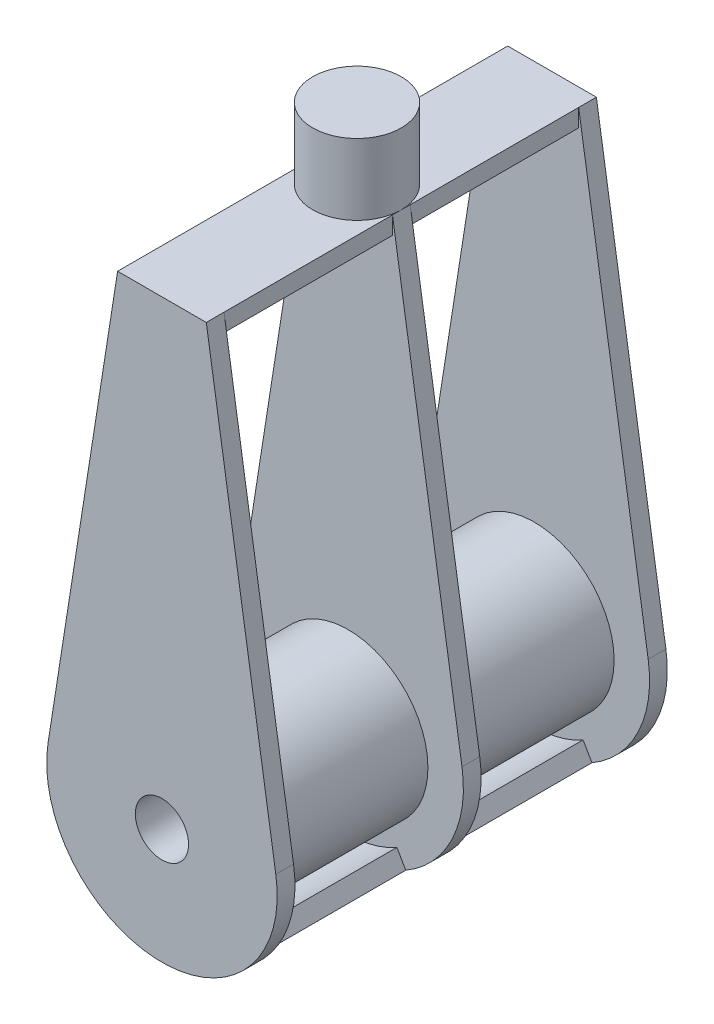
ISO-10303-21;
HEADER;
FILE_DESCRIPTION(('STEP AP214'),'2;1');
FILE_NAME('part.step','',(''),(''),'','','');
FILE_SCHEMA(('AUTOMOTIVE_DESIGN { 1 0 10303 214 1 1 1 1 }'));
ENDSEC;
DATA;
#1=APPLICATION_CONTEXT('core data for automotive mechanical design processes');
#2=APPLICATION_PROTOCOL_DEFINITION('international standard','automotive_design',2000,#1);
#3=PRODUCT_CONTEXT('',#1,'mechanical');
#4=PRODUCT('Part','Part','',(#3));
#5=PRODUCT_RELATED_PRODUCT_CATEGORY('part','',(#4));
#6=PRODUCT_DEFINITION_FORMATION('','',#4);
#7=PRODUCT_DEFINITION_CONTEXT('part definition',#1,'design');
#8=PRODUCT_DEFINITION('design','',#6,#7);
#9=PRODUCT_DEFINITION_SHAPE('','',#8);
#10=(LENGTH_UNIT() NAMED_UNIT(*) SI_UNIT(.MILLI.,.METRE.));
#11=(NAMED_UNIT(*) PLANE_ANGLE_UNIT() SI_UNIT($,.RADIAN.));
#12=(NAMED_UNIT(*) SI_UNIT($,.STERADIAN.) SOLID_ANGLE_UNIT());
#13=UNCERTAINTY_MEASURE_WITH_UNIT(LENGTH_MEASURE(1.E-05),#10,'distance_accuracy_value','');
#14=(GEOMETRIC_REPRESENTATION_CONTEXT(3) GLOBAL_UNCERTAINTY_ASSIGNED_CONTEXT((#13)) GLOBAL_UNIT_ASSIGNED_CONTEXT((#10,
#11,#12)) REPRESENTATION_CONTEXT('',''));
#15=CARTESIAN_POINT('',(0.,0.,0.));
#16=DIRECTION('',(0.,0.,1.));
#17=DIRECTION('',(1.,0.,0.));
#18=AXIS2_PLACEMENT_3D('',#15,#16,#17);
#19=CARTESIAN_POINT('',(-2.5,26.,1.));
#20=DIRECTION('',(0.,-1.,0.));
#21=DIRECTION('',(0.,0.,-1.));
#22=AXIS2_PLACEMENT_3D('',#19,#20,#21);
#23=PLANE('',#22);
#24=CARTESIAN_POINT('',(0.,26.,11.));
#25=DIRECTION('',(0.,1.,0.));
#26=DIRECTION('',(0.,0.,1.));
#27=AXIS2_PLACEMENT_3D('',#24,#25,#26);
#28=CIRCLE('',#27,2.49999999999773);
#29=CARTESIAN_POINT('',(-2.50000000004036,26.,11.));
#30=VERTEX_POINT('',#29);
#31=CARTESIAN_POINT('',(2.49999999999773,26.0000000000105,11.));
#32=VERTEX_POINT('',#31);
#33=EDGE_CURVE('E254',#30,#32,#28,.T.);
#34=ORIENTED_EDGE('',*,*,#33,.F.);
#35=DIRECTION('',(0.,0.,-1.));
#36=VECTOR('',#35,1.);
#37=CARTESIAN_POINT('',(-2.50000000005457,26.0000000000105,11.5));
#38=LINE('',#37,#36);
#39=CARTESIAN_POINT('',(-2.5,26.,11.5));
#40=VERTEX_POINT('',#39);
#41=EDGE_CURVE('E287',#40,#30,#38,.T.);
#42=ORIENTED_EDGE('',*,*,#41,.F.);
#43=DIRECTION('',(0.,0.,1.));
#44=VECTOR('',#43,1.);
#45=CARTESIAN_POINT('',(-2.5,26.,0.));
#46=LINE('',#45,#44);
#47=CARTESIAN_POINT('',(-2.5,26.,21.));
#48=VERTEX_POINT('',#47);
#49=EDGE_CURVE('E338',#40,#48,#46,.T.);
#50=ORIENTED_EDGE('',*,*,#49,.T.);
#51=DIRECTION('',(0.,0.,1.));
#52=VECTOR('',#51,1.);
#53=CARTESIAN_POINT('',(-2.5,26.,21.));
#54=LINE('',#53,#52);
#55=CARTESIAN_POINT('',(-2.5,26.,22.));
#56=VERTEX_POINT('',#55);
#57=EDGE_CURVE('E321',#48,#56,#54,.T.);
#58=ORIENTED_EDGE('',*,*,#57,.T.);
#59=DIRECTION('',(1.,0.,0.));
#60=VECTOR('',#59,1.);
#61=CARTESIAN_POINT('',(-2.5,26.,22.));
#62=LINE('',#61,#60);
#63=CARTESIAN_POINT('',(2.5,26.,22.));
#64=VERTEX_POINT('',#63);
#65=EDGE_CURVE('E355',#56,#64,#62,.T.);
#66=ORIENTED_EDGE('',*,*,#65,.T.);
#67=DIRECTION('',(0.,0.,-1.));
#68=VECTOR('',#67,1.);
#69=CARTESIAN_POINT('',(2.5,26.,0.));
#70=LINE('',#69,#68);
#71=CARTESIAN_POINT('',(2.5,26.,21.));
#72=VERTEX_POINT('',#71);
#73=EDGE_CURVE('E359',#64,#72,#70,.T.);
#74=ORIENTED_EDGE('',*,*,#73,.T.);
#75=CARTESIAN_POINT('',(2.49999999999773,26.0000000000105,11.5));
#76=VERTEX_POINT('',#75);
#77=EDGE_CURVE('E358',#72,#76,#70,.T.);
#78=ORIENTED_EDGE('',*,*,#77,.T.);
#79=DIRECTION('',(0.,0.,-1.));
#80=VECTOR('',#79,1.);
#81=CARTESIAN_POINT('',(2.49999999999773,26.0000000000105,11.5));
#82=LINE('',#81,#80);
#83=EDGE_CURVE('E282',#76,#32,#82,.T.);
#84=ORIENTED_EDGE('',*,*,#83,.T.);
#85=EDGE_LOOP('',(#34,#42,#50,#58,#66,#74,#78,#84));
#86=FACE_BOUND('',#85,.T.);
#87=ADVANCED_FACE('F41',(#86),#23,.F.);
#88=CARTESIAN_POINT('',(-2.5,25.,0.));
#89=DIRECTION('',(-1.,0.,0.));
#90=DIRECTION('',(0.,0.,1.));
#91=AXIS2_PLACEMENT_3D('',#88,#89,#90);
#92=PLANE('',#91);
#93=DIRECTION('',(0.,0.,1.));
#94=VECTOR('',#93,1.);
#95=CARTESIAN_POINT('',(-2.5,25.,0.));
#96=LINE('',#95,#94);
#97=CARTESIAN_POINT('',(-2.5,25.,1.));
#98=VERTEX_POINT('',#97);
#99=CARTESIAN_POINT('',(-2.5,25.,10.5));
#100=VERTEX_POINT('',#99);
#101=EDGE_CURVE('E342',#98,#100,#96,.T.);
#102=ORIENTED_EDGE('',*,*,#101,.T.);
#103=DIRECTION('',(0.,1.,0.));
#104=VECTOR('',#103,1.);
#105=CARTESIAN_POINT('',(-2.5,25.,10.5));
#106=LINE('',#105,#104);
#107=CARTESIAN_POINT('',(-2.50000000005457,26.0000000000105,10.5));
#108=VERTEX_POINT('',#107);
#109=EDGE_CURVE('E299',#100,#108,#106,.T.);
#110=ORIENTED_EDGE('',*,*,#109,.T.);
#111=CARTESIAN_POINT('',(-2.5,26.,1.));
#112=VERTEX_POINT('',#111);
#113=EDGE_CURVE('E348',#112,#108,#46,.T.);
#114=ORIENTED_EDGE('',*,*,#113,.F.);
#115=DIRECTION('',(0.,-1.,0.));
#116=VECTOR('',#115,1.);
#117=CARTESIAN_POINT('',(-2.5,0.,1.));
#118=LINE('',#117,#116);
#119=EDGE_CURVE('E349',#112,#98,#118,.T.);
#120=ORIENTED_EDGE('',*,*,#119,.T.);
#121=EDGE_LOOP('',(#102,#110,#114,#120));
#122=FACE_BOUND('',#121,.T.);
#123=ADVANCED_FACE('F514',(#122),#92,.T.);
#124=CARTESIAN_POINT('',(2.5,25.,0.));
#125=DIRECTION('',(1.,0.,0.));
#126=DIRECTION('',(0.,0.,-1.));
#127=AXIS2_PLACEMENT_3D('',#124,#125,#126);
#128=PLANE('',#127);
#129=CARTESIAN_POINT('',(2.49999999999773,26.0000000000105,10.5));
#130=VERTEX_POINT('',#129);
#131=CARTESIAN_POINT('',(2.5,26.,1.));
#132=VERTEX_POINT('',#131);
#133=EDGE_CURVE('E357',#130,#132,#70,.T.);
#134=ORIENTED_EDGE('',*,*,#133,.F.);
#135=DIRECTION('',(0.,-1.,0.));
#136=VECTOR('',#135,1.);
#137=CARTESIAN_POINT('',(2.5,25.,10.5));
#138=LINE('',#137,#136);
#139=CARTESIAN_POINT('',(2.5,25.,10.5));
#140=VERTEX_POINT('',#139);
#141=EDGE_CURVE('E294',#130,#140,#138,.T.);
#142=ORIENTED_EDGE('',*,*,#141,.T.);
#143=DIRECTION('',(0.,0.,-1.));
#144=VECTOR('',#143,1.);
#145=CARTESIAN_POINT('',(2.5,25.,0.));
#146=LINE('',#145,#144);
#147=CARTESIAN_POINT('',(2.5,25.,1.));
#148=VERTEX_POINT('',#147);
#149=EDGE_CURVE('E341',#140,#148,#146,.T.);
#150=ORIENTED_EDGE('',*,*,#149,.T.);
#151=DIRECTION('',(0.,1.,0.));
#152=VECTOR('',#151,1.);
#153=CARTESIAN_POINT('',(2.5,0.,1.));
#154=LINE('',#153,#152);
#155=EDGE_CURVE('E361',#148,#132,#154,.T.);
#156=ORIENTED_EDGE('',*,*,#155,.T.);
#157=EDGE_LOOP('',(#134,#142,#150,#156));
#158=FACE_BOUND('',#157,.T.);
#159=ADVANCED_FACE('F503',(#158),#128,.T.);
#160=CARTESIAN_POINT('',(0.,25.,0.));
#161=DIRECTION('',(0.,1.,0.));
#162=DIRECTION('',(0.,0.,1.));
#163=AXIS2_PLACEMENT_3D('',#160,#161,#162);
#164=PLANE('',#163);
#165=DIRECTION('',(1.,0.,0.));
#166=VECTOR('',#165,1.);
#167=CARTESIAN_POINT('',(0.,25.,10.5));
#168=LINE('',#167,#166);
#169=EDGE_CURVE('E281',#100,#140,#168,.T.);
#170=ORIENTED_EDGE('',*,*,#169,.F.);
#171=ORIENTED_EDGE('',*,*,#101,.F.);
#172=DIRECTION('',(-1.,0.,0.));
#173=VECTOR('',#172,1.);
#174=CARTESIAN_POINT('',(0.,25.,1.));
#175=LINE('',#174,#173);
#176=EDGE_CURVE('E368',#148,#98,#175,.T.);
#177=ORIENTED_EDGE('',*,*,#176,.F.);
#178=ORIENTED_EDGE('',*,*,#149,.F.);
#179=EDGE_LOOP('',(#170,#171,#177,#178));
#180=FACE_BOUND('',#179,.T.);
#181=ADVANCED_FACE('F515',(#180),#164,.F.);
#182=DIRECTION('',(0.,1.,0.));
#183=VECTOR('',#182,1.);
#184=CARTESIAN_POINT('',(-2.5,25.,11.5));
#185=LINE('',#184,#183);
#186=CARTESIAN_POINT('',(-2.5,25.,11.5));
#187=VERTEX_POINT('',#186);
#188=EDGE_CURVE('E303',#187,#40,#185,.T.);
#189=ORIENTED_EDGE('',*,*,#188,.F.);
#190=CARTESIAN_POINT('',(-2.5,25.,21.));
#191=VERTEX_POINT('',#190);
#192=EDGE_CURVE('E343',#187,#191,#96,.T.);
#193=ORIENTED_EDGE('',*,*,#192,.T.);
#194=DIRECTION('',(0.,1.,0.));
#195=VECTOR('',#194,1.);
#196=CARTESIAN_POINT('',(-2.5,25.,21.));
#197=LINE('',#196,#195);
#198=EDGE_CURVE('E339',#191,#48,#197,.T.);
#199=ORIENTED_EDGE('',*,*,#198,.T.);
#200=ORIENTED_EDGE('',*,*,#49,.F.);
#201=EDGE_LOOP('',(#189,#193,#199,#200));
#202=FACE_BOUND('',#201,.T.);
#203=ADVANCED_FACE('F444',(#202),#92,.T.);
#204=DIRECTION('',(0.,-1.,0.));
#205=VECTOR('',#204,1.);
#206=CARTESIAN_POINT('',(2.5,25.,11.5));
#207=LINE('',#206,#205);
#208=CARTESIAN_POINT('',(2.5,25.,11.5));
#209=VERTEX_POINT('',#208);
#210=EDGE_CURVE('E305',#76,#209,#207,.T.);
#211=ORIENTED_EDGE('',*,*,#210,.F.);
#212=ORIENTED_EDGE('',*,*,#77,.F.);
#213=DIRECTION('',(0.,-1.,0.));
#214=VECTOR('',#213,1.);
#215=CARTESIAN_POINT('',(2.5,25.,21.));
#216=LINE('',#215,#214);
#217=CARTESIAN_POINT('',(2.5,25.,21.));
#218=VERTEX_POINT('',#217);
#219=EDGE_CURVE('E331',#72,#218,#216,.T.);
#220=ORIENTED_EDGE('',*,*,#219,.T.);
#221=EDGE_CURVE('E347',#218,#209,#146,.T.);
#222=ORIENTED_EDGE('',*,*,#221,.T.);
#223=EDGE_LOOP('',(#211,#212,#220,#222));
#224=FACE_BOUND('',#223,.T.);
#225=ADVANCED_FACE('F455',(#224),#128,.T.);
#226=ORIENTED_EDGE('',*,*,#192,.F.);
#227=DIRECTION('',(1.,0.,0.));
#228=VECTOR('',#227,1.);
#229=CARTESIAN_POINT('',(0.,25.,11.5));
#230=LINE('',#229,#228);
#231=EDGE_CURVE('E298',#187,#209,#230,.T.);
#232=ORIENTED_EDGE('',*,*,#231,.T.);
#233=ORIENTED_EDGE('',*,*,#221,.F.);
#234=DIRECTION('',(1.,0.,0.));
#235=VECTOR('',#234,1.);
#236=CARTESIAN_POINT('',(0.,25.,21.));
#237=LINE('',#236,#235);
#238=EDGE_CURVE('E396',#191,#218,#237,.T.);
#239=ORIENTED_EDGE('',*,*,#238,.F.);
#240=EDGE_LOOP('',(#226,#232,#233,#239));
#241=FACE_BOUND('',#240,.T.);
#242=ADVANCED_FACE('F449',(#241),#164,.F.);
#243=CARTESIAN_POINT('',(0.,0.,1.));
#244=DIRECTION('',(0.,0.,1.));
#245=DIRECTION('',(1.,0.,0.));
#246=AXIS2_PLACEMENT_3D('',#243,#244,#245);
#247=PLANE('',#246);
#248=CARTESIAN_POINT('',(0.,0.,1.));
#249=DIRECTION('',(0.,0.,1.));
#250=DIRECTION('',(1.,0.,0.));
#251=AXIS2_PLACEMENT_3D('',#248,#249,#250);
#252=CIRCLE('',#251,4.5);
#253=CARTESIAN_POINT('',(4.5,0.,1.));
#254=VERTEX_POINT('',#253);
#255=EDGE_CURVE('E11',#254,#254,#252,.T.);
#256=ORIENTED_EDGE('',*,*,#255,.F.);
#257=EDGE_LOOP('',(#256));
#258=FACE_BOUND('',#257,.T.);
#259=DIRECTION('',(-0.500000000000001,-0.866025403784438,0.));
#260=VECTOR('',#259,1.);
#261=CARTESIAN_POINT('',(0.,0.,1.));
#262=LINE('',#261,#260);
#263=CARTESIAN_POINT('',(-2.75,-4.76313972081441,1.));
#264=VERTEX_POINT('',#263);
#265=CARTESIAN_POINT('',(-3.25,-5.62916512459885,1.));
#266=VERTEX_POINT('',#265);
#267=EDGE_CURVE('E59',#264,#266,#262,.T.);
#268=ORIENTED_EDGE('',*,*,#267,.F.);
#269=CARTESIAN_POINT('',(0.,0.,1.));
#270=DIRECTION('',(0.,0.,1.));
#271=DIRECTION('',(1.,0.,0.));
#272=AXIS2_PLACEMENT_3D('',#269,#270,#271);
#273=CIRCLE('',#272,5.5);
#274=CARTESIAN_POINT('',(2.75000000000001,-4.76313972081441,1.));
#275=VERTEX_POINT('',#274);
#276=EDGE_CURVE('E64',#275,#264,#273,.F.);
#277=ORIENTED_EDGE('',*,*,#276,.F.);
#278=DIRECTION('',(-0.500000000000001,0.866025403784438,0.));
#279=VECTOR('',#278,1.);
#280=CARTESIAN_POINT('',(0.,0.,1.));
#281=LINE('',#280,#279);
#282=CARTESIAN_POINT('',(3.25000000000001,-5.62916512459885,1.00000000000001));
#283=VERTEX_POINT('',#282);
#284=EDGE_CURVE('E240',#283,#275,#281,.T.);
#285=ORIENTED_EDGE('',*,*,#284,.F.);
#286=CARTESIAN_POINT('',(0.,0.,1.));
#287=DIRECTION('',(0.,0.,1.));
#288=DIRECTION('',(1.,0.,0.));
#289=AXIS2_PLACEMENT_3D('',#286,#287,#288);
#290=CIRCLE('',#289,6.5);
#291=CARTESIAN_POINT('',(6.42143553909513,1.00755427508701,1.));
#292=VERTEX_POINT('',#291);
#293=EDGE_CURVE('E374',#283,#292,#290,.T.);
#294=ORIENTED_EDGE('',*,*,#293,.T.);
#295=DIRECTION('',(-0.155008350013386,0.987913159860788,0.));
#296=VECTOR('',#295,1.);
#297=CARTESIAN_POINT('',(2.5,26.,1.));
#298=LINE('',#297,#296);
#299=EDGE_CURVE('E372',#292,#132,#298,.T.);
#300=ORIENTED_EDGE('',*,*,#299,.T.);
#301=ORIENTED_EDGE('',*,*,#155,.F.);
#302=ORIENTED_EDGE('',*,*,#176,.T.);
#303=ORIENTED_EDGE('',*,*,#119,.F.);
#304=DIRECTION('',(-0.155008350013386,-0.987913159860788,0.));
#305=VECTOR('',#304,1.);
#306=CARTESIAN_POINT('',(-2.5,26.,1.));
#307=LINE('',#306,#305);
#308=CARTESIAN_POINT('',(-6.42143553909513,1.00755427508701,1.));
#309=VERTEX_POINT('',#308);
#310=EDGE_CURVE('E378',#112,#309,#307,.T.);
#311=ORIENTED_EDGE('',*,*,#310,.T.);
#312=EDGE_CURVE('E375',#309,#266,#290,.T.);
#313=ORIENTED_EDGE('',*,*,#312,.T.);
#314=EDGE_LOOP('',(#268,#277,#285,#294,#300,#301,#302,#303,#311,#313));
#315=FACE_BOUND('',#314,.T.);
#316=ADVANCED_FACE('F485',(#258,#315),#247,.T.);
#317=CARTESIAN_POINT('',(0.,0.,0.));
#318=DIRECTION('',(0.,0.,1.));
#319=DIRECTION('',(1.,0.,0.));
#320=AXIS2_PLACEMENT_3D('',#317,#318,#319);
#321=PLANE('',#320);
#322=DIRECTION('',(-0.155008350013386,0.987913159860788,0.));
#323=VECTOR('',#322,1.);
#324=CARTESIAN_POINT('',(2.5,26.,0.));
#325=LINE('',#324,#323);
#326=CARTESIAN_POINT('',(6.42143553909513,1.00755427508701,0.));
#327=VERTEX_POINT('',#326);
#328=CARTESIAN_POINT('',(2.5,26.,0.));
#329=VERTEX_POINT('',#328);
#330=EDGE_CURVE('E385',#327,#329,#325,.T.);
#331=ORIENTED_EDGE('',*,*,#330,.F.);
#332=CARTESIAN_POINT('',(0.,0.,0.));
#333=DIRECTION('',(0.,0.,1.));
#334=DIRECTION('',(1.,0.,0.));
#335=AXIS2_PLACEMENT_3D('',#332,#333,#334);
#336=CIRCLE('',#335,6.5);
#337=CARTESIAN_POINT('',(-6.42143553909513,1.00755427508701,0.));
#338=VERTEX_POINT('',#337);
#339=EDGE_CURVE('E371',#338,#327,#336,.T.);
#340=ORIENTED_EDGE('',*,*,#339,.F.);
#341=DIRECTION('',(-0.155008350013386,-0.987913159860788,0.));
#342=VECTOR('',#341,1.);
#343=CARTESIAN_POINT('',(-2.5,26.,0.));
#344=LINE('',#343,#342);
#345=CARTESIAN_POINT('',(-2.5,26.,0.));
#346=VERTEX_POINT('',#345);
#347=EDGE_CURVE('E387',#346,#338,#344,.T.);
#348=ORIENTED_EDGE('',*,*,#347,.F.);
#349=DIRECTION('',(-1.,0.,0.));
#350=VECTOR('',#349,1.);
#351=CARTESIAN_POINT('',(-2.5,26.,0.));
#352=LINE('',#351,#350);
#353=EDGE_CURVE('E383',#329,#346,#352,.T.);
#354=ORIENTED_EDGE('',*,*,#353,.F.);
#355=EDGE_LOOP('',(#331,#340,#348,#354));
#356=FACE_BOUND('',#355,.T.);
#357=CARTESIAN_POINT('',(0.,0.,0.));
#358=DIRECTION('',(0.,0.,1.));
#359=DIRECTION('',(1.,0.,0.));
#360=AXIS2_PLACEMENT_3D('',#357,#358,#359);
#361=CIRCLE('',#360,1.5);
#362=CARTESIAN_POINT('',(1.5,0.,0.));
#363=VERTEX_POINT('',#362);
#364=EDGE_CURVE('E366',#363,#363,#361,.T.);
#365=ORIENTED_EDGE('',*,*,#364,.T.);
#366=EDGE_LOOP('',(#365));
#367=FACE_BOUND('',#366,.T.);
#368=ADVANCED_FACE('F497',(#356,#367),#321,.F.);
#369=CARTESIAN_POINT('',(0.,0.,1.));
#370=DIRECTION('',(0.,0.,-1.));
#371=DIRECTION('',(-1.,0.,0.));
#372=AXIS2_PLACEMENT_3D('',#369,#370,#371);
#373=CYLINDRICAL_SURFACE('',#372,6.5);
#374=ORIENTED_EDGE('',*,*,#293,.F.);
#375=DIRECTION('',(0.,0.,-1.));
#376=VECTOR('',#375,1.);
#377=CARTESIAN_POINT('',(3.25000000000001,-5.62916512459885,28.7280519936615));
#378=LINE('',#377,#376);
#379=CARTESIAN_POINT('',(3.25000000000001,-5.62916512459885,10.5));
#380=VERTEX_POINT('',#379);
#381=EDGE_CURVE('E232',#380,#283,#378,.T.);
#382=ORIENTED_EDGE('',*,*,#381,.F.);
#383=CARTESIAN_POINT('',(0.,0.,10.5));
#384=DIRECTION('',(0.,0.,1.));
#385=DIRECTION('',(1.,0.,0.));
#386=AXIS2_PLACEMENT_3D('',#383,#384,#385);
#387=CIRCLE('',#386,6.5);
#388=CARTESIAN_POINT('',(6.42143553909703,1.00755427507487,10.5));
#389=VERTEX_POINT('',#388);
#390=EDGE_CURVE('E274',#380,#389,#387,.T.);
#391=ORIENTED_EDGE('',*,*,#390,.T.);
#392=DIRECTION('',(0.,0.,-1.));
#393=VECTOR('',#392,1.);
#394=CARTESIAN_POINT('',(6.42143553909703,1.00755427507487,11.5));
#395=LINE('',#394,#393);
#396=CARTESIAN_POINT('',(6.42143553909703,1.00755427507487,11.5));
#397=VERTEX_POINT('',#396);
#398=EDGE_CURVE('E275',#397,#389,#395,.T.);
#399=ORIENTED_EDGE('',*,*,#398,.F.);
#400=CARTESIAN_POINT('',(0.,0.,11.5));
#401=DIRECTION('',(0.,0.,1.));
#402=DIRECTION('',(1.,0.,0.));
#403=AXIS2_PLACEMENT_3D('',#400,#401,#402);
#404=CIRCLE('',#403,6.5);
#405=CARTESIAN_POINT('',(3.25000000000001,-5.62916512459885,11.5));
#406=VERTEX_POINT('',#405);
#407=EDGE_CURVE('E266',#406,#397,#404,.T.);
#408=ORIENTED_EDGE('',*,*,#407,.F.);
#409=CARTESIAN_POINT('',(3.25000000000001,-5.62916512459885,21.));
#410=VERTEX_POINT('',#409);
#411=EDGE_CURVE('E411',#410,#406,#378,.T.);
#412=ORIENTED_EDGE('',*,*,#411,.F.);
#413=CARTESIAN_POINT('',(0.,0.,21.));
#414=DIRECTION('',(0.,0.,1.));
#415=DIRECTION('',(1.,0.,0.));
#416=AXIS2_PLACEMENT_3D('',#413,#414,#415);
#417=CIRCLE('',#416,6.5);
#418=CARTESIAN_POINT('',(6.42143553909513,1.007554275087,21.));
#419=VERTEX_POINT('',#418);
#420=EDGE_CURVE('E237',#410,#419,#417,.T.);
#421=ORIENTED_EDGE('',*,*,#420,.T.);
#422=DIRECTION('',(0.,0.,1.));
#423=VECTOR('',#422,1.);
#424=CARTESIAN_POINT('',(6.42143553909513,1.007554275087,21.));
#425=LINE('',#424,#423);
#426=CARTESIAN_POINT('',(6.42143553909513,1.007554275087,22.));
#427=VERTEX_POINT('',#426);
#428=EDGE_CURVE('E332',#419,#427,#425,.T.);
#429=ORIENTED_EDGE('',*,*,#428,.T.);
#430=CARTESIAN_POINT('',(0.,0.,22.));
#431=DIRECTION('',(0.,0.,1.));
#432=DIRECTION('',(1.,0.,0.));
#433=AXIS2_PLACEMENT_3D('',#430,#431,#432);
#434=CIRCLE('',#433,6.5);
#435=CARTESIAN_POINT('',(-6.42143553909513,1.00755427508701,22.));
#436=VERTEX_POINT('',#435);
#437=EDGE_CURVE('E322',#436,#427,#434,.T.);
#438=ORIENTED_EDGE('',*,*,#437,.F.);
#439=DIRECTION('',(0.,0.,1.));
#440=VECTOR('',#439,1.);
#441=CARTESIAN_POINT('',(-6.42143553909513,1.00755427508701,21.));
#442=LINE('',#441,#440);
#443=CARTESIAN_POINT('',(-6.42143553909513,1.00755427508701,21.));
#444=VERTEX_POINT('',#443);
#445=EDGE_CURVE('E328',#444,#436,#442,.T.);
#446=ORIENTED_EDGE('',*,*,#445,.F.);
#447=CARTESIAN_POINT('',(-3.25,-5.62916512459885,21.));
#448=VERTEX_POINT('',#447);
#449=EDGE_CURVE('E312',#444,#448,#417,.T.);
#450=ORIENTED_EDGE('',*,*,#449,.T.);
#451=DIRECTION('',(0.,0.,-1.));
#452=VECTOR('',#451,1.);
#453=CARTESIAN_POINT('',(-3.25,-5.62916512459885,28.7280519936615));
#454=LINE('',#453,#452);
#455=CARTESIAN_POINT('',(-3.25,-5.62916512459885,11.5));
#456=VERTEX_POINT('',#455);
#457=EDGE_CURVE('E423',#448,#456,#454,.T.);
#458=ORIENTED_EDGE('',*,*,#457,.T.);
#459=CARTESIAN_POINT('',(-6.42143553913144,1.00755427507693,11.5));
#460=VERTEX_POINT('',#459);
#461=EDGE_CURVE('E268',#460,#456,#404,.T.);
#462=ORIENTED_EDGE('',*,*,#461,.F.);
#463=DIRECTION('',(0.,0.,-1.));
#464=VECTOR('',#463,1.);
#465=CARTESIAN_POINT('',(-6.42143553913144,1.00755427507693,11.5));
#466=LINE('',#465,#464);
#467=CARTESIAN_POINT('',(-6.42143553913144,1.00755427507693,10.5));
#468=VERTEX_POINT('',#467);
#469=EDGE_CURVE('E286',#460,#468,#466,.T.);
#470=ORIENTED_EDGE('',*,*,#469,.T.);
#471=CARTESIAN_POINT('',(-3.25,-5.62916512459885,10.5));
#472=VERTEX_POINT('',#471);
#473=EDGE_CURVE('E277',#468,#472,#387,.T.);
#474=ORIENTED_EDGE('',*,*,#473,.T.);
#475=EDGE_CURVE('E420',#472,#266,#454,.T.);
#476=ORIENTED_EDGE('',*,*,#475,.T.);
#477=ORIENTED_EDGE('',*,*,#312,.F.);
#478=DIRECTION('',(0.,0.,-1.));
#479=VECTOR('',#478,1.);
#480=CARTESIAN_POINT('',(-6.42143553909513,1.00755427508701,1.));
#481=LINE('',#480,#479);
#482=EDGE_CURVE('E379',#309,#338,#481,.T.);
#483=ORIENTED_EDGE('',*,*,#482,.T.);
#484=ORIENTED_EDGE('',*,*,#339,.T.);
#485=DIRECTION('',(0.,0.,-1.));
#486=VECTOR('',#485,1.);
#487=CARTESIAN_POINT('',(6.42143553909513,1.00755427508701,1.));
#488=LINE('',#487,#486);
#489=EDGE_CURVE('E397',#292,#327,#488,.T.);
#490=ORIENTED_EDGE('',*,*,#489,.F.);
#491=EDGE_LOOP('',(#374,#382,#391,#399,#408,#412,#421,#429,#438,#446,#450,#458,#462,#470,#474,
#476,#477,#483,#484,#490));
#492=FACE_BOUND('',#491,.T.);
#493=ADVANCED_FACE('F43',(#492),#373,.T.);
#494=CARTESIAN_POINT('',(2.5,26.,1.));
#495=DIRECTION('',(-0.987913159860788,-0.155008350013386,0.));
#496=DIRECTION('',(0.155008350013386,-0.987913159860788,0.));
#497=AXIS2_PLACEMENT_3D('',#494,#495,#496);
#498=PLANE('',#497);
#499=ORIENTED_EDGE('',*,*,#330,.T.);
#500=DIRECTION('',(0.,0.,-1.));
#501=VECTOR('',#500,1.);
#502=CARTESIAN_POINT('',(2.5,26.,1.));
#503=LINE('',#502,#501);
#504=EDGE_CURVE('E395',#132,#329,#503,.T.);
#505=ORIENTED_EDGE('',*,*,#504,.F.);
#506=ORIENTED_EDGE('',*,*,#299,.F.);
#507=ORIENTED_EDGE('',*,*,#489,.T.);
#508=EDGE_LOOP('',(#499,#505,#506,#507));
#509=FACE_BOUND('',#508,.T.);
#510=ADVANCED_FACE('F488',(#509),#498,.F.);
#511=EDGE_CURVE('E257',#32,#30,#28,.T.);
#512=ORIENTED_EDGE('',*,*,#511,.F.);
#513=EDGE_CURVE('E283',#32,#130,#82,.T.);
#514=ORIENTED_EDGE('',*,*,#513,.T.);
#515=ORIENTED_EDGE('',*,*,#133,.T.);
#516=ORIENTED_EDGE('',*,*,#504,.T.);
#517=ORIENTED_EDGE('',*,*,#353,.T.);
#518=DIRECTION('',(0.,0.,-1.));
#519=VECTOR('',#518,1.);
#520=CARTESIAN_POINT('',(-2.5,26.,1.));
#521=LINE('',#520,#519);
#522=EDGE_CURVE('E388',#112,#346,#521,.T.);
#523=ORIENTED_EDGE('',*,*,#522,.F.);
#524=ORIENTED_EDGE('',*,*,#113,.T.);
#525=EDGE_CURVE('E290',#30,#108,#38,.T.);
#526=ORIENTED_EDGE('',*,*,#525,.F.);
#527=EDGE_LOOP('',(#512,#514,#515,#516,#517,#523,#524,#526));
#528=FACE_BOUND('',#527,.T.);
#529=ADVANCED_FACE('F496',(#528),#23,.F.);
#530=CARTESIAN_POINT('',(-2.5,26.,1.));
#531=DIRECTION('',(0.987913159860788,-0.155008350013386,0.));
#532=DIRECTION('',(0.155008350013386,0.987913159860788,0.));
#533=AXIS2_PLACEMENT_3D('',#530,#531,#532);
#534=PLANE('',#533);
#535=ORIENTED_EDGE('',*,*,#347,.T.);
#536=ORIENTED_EDGE('',*,*,#482,.F.);
#537=ORIENTED_EDGE('',*,*,#310,.F.);
#538=ORIENTED_EDGE('',*,*,#522,.T.);
#539=EDGE_LOOP('',(#535,#536,#537,#538));
#540=FACE_BOUND('',#539,.T.);
#541=ADVANCED_FACE('F519',(#540),#534,.F.);
#542=CARTESIAN_POINT('',(0.,0.,1.));
#543=DIRECTION('',(0.,0.,-1.));
#544=DIRECTION('',(-1.,0.,0.));
#545=AXIS2_PLACEMENT_3D('',#542,#543,#544);
#546=CYLINDRICAL_SURFACE('',#545,1.5);
#547=ORIENTED_EDGE('',*,*,#364,.F.);
#548=EDGE_LOOP('',(#547));
#549=FACE_BOUND('',#548,.T.);
#550=CARTESIAN_POINT('',(0.,0.,22.));
#551=DIRECTION('',(0.,0.,1.));
#552=DIRECTION('',(1.,0.,0.));
#553=AXIS2_PLACEMENT_3D('',#550,#551,#552);
#554=CIRCLE('',#553,1.5);
#555=CARTESIAN_POINT('',(1.5,0.,22.));
#556=VERTEX_POINT('',#555);
#557=EDGE_CURVE('E306',#556,#556,#554,.T.);
#558=ORIENTED_EDGE('',*,*,#557,.T.);
#559=EDGE_LOOP('',(#558));
#560=FACE_BOUND('',#559,.T.);
#561=ADVANCED_FACE('F547',(#549,#560),#546,.F.);
#562=CARTESIAN_POINT('',(-2.5,25.,22.));
#563=DIRECTION('',(0.,0.,1.));
#564=DIRECTION('',(1.,0.,0.));
#565=AXIS2_PLACEMENT_3D('',#562,#563,#564);
#566=PLANE('',#565);
#567=ORIENTED_EDGE('',*,*,#437,.T.);
#568=DIRECTION('',(0.155008350013386,-0.987913159860788,0.));
#569=VECTOR('',#568,1.);
#570=CARTESIAN_POINT('',(2.53299684599717,25.7897015329065,22.));
#571=LINE('',#570,#569);
#572=EDGE_CURVE('E313',#64,#427,#571,.T.);
#573=ORIENTED_EDGE('',*,*,#572,.F.);
#574=ORIENTED_EDGE('',*,*,#65,.F.);
#575=DIRECTION('',(0.155008350013386,0.987913159860788,0.));
#576=VECTOR('',#575,1.);
#577=CARTESIAN_POINT('',(-2.65313478886653,25.0240275885739,22.));
#578=LINE('',#577,#576);
#579=EDGE_CURVE('E314',#436,#56,#578,.T.);
#580=ORIENTED_EDGE('',*,*,#579,.F.);
#581=EDGE_LOOP('',(#567,#573,#574,#580));
#582=FACE_BOUND('',#581,.T.);
#583=ORIENTED_EDGE('',*,*,#557,.F.);
#584=EDGE_LOOP('',(#583));
#585=FACE_BOUND('',#584,.T.);
#586=ADVANCED_FACE('F462',(#582,#585),#566,.T.);
#587=CARTESIAN_POINT('',(2.53299684599717,25.7897015329065,21.));
#588=DIRECTION('',(-0.987913159860788,-0.155008350013386,0.));
#589=DIRECTION('',(0.155008350013386,-0.987913159860788,0.));
#590=AXIS2_PLACEMENT_3D('',#587,#588,#589);
#591=PLANE('',#590);
#592=ORIENTED_EDGE('',*,*,#572,.T.);
#593=ORIENTED_EDGE('',*,*,#428,.F.);
#594=DIRECTION('',(0.155008350013386,-0.987913159860788,0.));
#595=VECTOR('',#594,1.);
#596=CARTESIAN_POINT('',(2.53299684599717,25.7897015329065,21.));
#597=LINE('',#596,#595);
#598=EDGE_CURVE('E315',#72,#419,#597,.T.);
#599=ORIENTED_EDGE('',*,*,#598,.F.);
#600=ORIENTED_EDGE('',*,*,#73,.F.);
#601=EDGE_LOOP('',(#592,#593,#599,#600));
#602=FACE_BOUND('',#601,.T.);
#603=ADVANCED_FACE('F456',(#602),#591,.F.);
#604=CARTESIAN_POINT('',(-2.65313478886653,25.0240275885739,21.));
#605=DIRECTION('',(0.987913159860788,-0.155008350013386,0.));
#606=DIRECTION('',(0.155008350013386,0.987913159860788,0.));
#607=AXIS2_PLACEMENT_3D('',#604,#605,#606);
#608=PLANE('',#607);
#609=ORIENTED_EDGE('',*,*,#579,.T.);
#610=ORIENTED_EDGE('',*,*,#57,.F.);
#611=DIRECTION('',(0.155008350013386,0.987913159860788,0.));
#612=VECTOR('',#611,1.);
#613=CARTESIAN_POINT('',(-2.65313478886653,25.0240275885739,21.));
#614=LINE('',#613,#612);
#615=EDGE_CURVE('E318',#444,#48,#614,.T.);
#616=ORIENTED_EDGE('',*,*,#615,.F.);
#617=ORIENTED_EDGE('',*,*,#445,.T.);
#618=EDGE_LOOP('',(#609,#610,#616,#617));
#619=FACE_BOUND('',#618,.T.);
#620=ADVANCED_FACE('F436',(#619),#608,.F.);
#621=CARTESIAN_POINT('',(0.,0.,21.));
#622=DIRECTION('',(0.,0.,1.));
#623=DIRECTION('',(1.,0.,0.));
#624=AXIS2_PLACEMENT_3D('',#621,#622,#623);
#625=PLANE('',#624);
#626=CARTESIAN_POINT('',(0.,0.,21.));
#627=DIRECTION('',(0.,0.,1.));
#628=DIRECTION('',(1.,0.,0.));
#629=AXIS2_PLACEMENT_3D('',#626,#627,#628);
#630=CIRCLE('',#629,4.5);
#631=CARTESIAN_POINT('',(4.5,0.,21.));
#632=VERTEX_POINT('',#631);
#633=EDGE_CURVE('E406',#632,#632,#630,.T.);
#634=ORIENTED_EDGE('',*,*,#633,.T.);
#635=EDGE_LOOP('',(#634));
#636=FACE_BOUND('',#635,.T.);
#637=CARTESIAN_POINT('',(0.,0.,21.));
#638=DIRECTION('',(0.,0.,1.));
#639=DIRECTION('',(1.,0.,0.));
#640=AXIS2_PLACEMENT_3D('',#637,#638,#639);
#641=CIRCLE('',#640,5.5);
#642=CARTESIAN_POINT('',(2.75,-4.76313972081441,21.));
#643=VERTEX_POINT('',#642);
#644=CARTESIAN_POINT('',(-2.75,-4.76313972081441,21.));
#645=VERTEX_POINT('',#644);
#646=EDGE_CURVE('E209',#643,#645,#641,.F.);
#647=ORIENTED_EDGE('',*,*,#646,.T.);
#648=DIRECTION('',(-0.500000000000001,-0.866025403784438,0.));
#649=VECTOR('',#648,1.);
#650=CARTESIAN_POINT('',(0.,0.,21.));
#651=LINE('',#650,#649);
#652=EDGE_CURVE('E248',#645,#448,#651,.T.);
#653=ORIENTED_EDGE('',*,*,#652,.T.);
#654=ORIENTED_EDGE('',*,*,#449,.F.);
#655=ORIENTED_EDGE('',*,*,#615,.T.);
#656=ORIENTED_EDGE('',*,*,#198,.F.);
#657=ORIENTED_EDGE('',*,*,#238,.T.);
#658=ORIENTED_EDGE('',*,*,#219,.F.);
#659=ORIENTED_EDGE('',*,*,#598,.T.);
#660=ORIENTED_EDGE('',*,*,#420,.F.);
#661=DIRECTION('',(-0.500000000000001,0.866025403784438,0.));
#662=VECTOR('',#661,1.);
#663=CARTESIAN_POINT('',(0.,0.,21.));
#664=LINE('',#663,#662);
#665=EDGE_CURVE('E229',#410,#643,#664,.T.);
#666=ORIENTED_EDGE('',*,*,#665,.T.);
#667=EDGE_LOOP('',(#647,#653,#654,#655,#656,#657,#658,#659,#660,#666));
#668=FACE_BOUND('',#667,.T.);
#669=ADVANCED_FACE('F231',(#636,#668),#625,.F.);
#670=CARTESIAN_POINT('',(0.,0.,11.5));
#671=DIRECTION('',(0.,0.,1.));
#672=DIRECTION('',(1.,0.,0.));
#673=AXIS2_PLACEMENT_3D('',#670,#671,#672);
#674=PLANE('',#673);
#675=CARTESIAN_POINT('',(0.,0.,11.5));
#676=DIRECTION('',(0.,0.,1.));
#677=DIRECTION('',(1.,0.,0.));
#678=AXIS2_PLACEMENT_3D('',#675,#676,#677);
#679=CIRCLE('',#678,4.5);
#680=CARTESIAN_POINT('',(4.5,0.,11.5));
#681=VERTEX_POINT('',#680);
#682=EDGE_CURVE('E49',#681,#681,#679,.T.);
#683=ORIENTED_EDGE('',*,*,#682,.F.);
#684=EDGE_LOOP('',(#683));
#685=FACE_BOUND('',#684,.T.);
#686=DIRECTION('',(-0.500000000000001,-0.866025403784438,0.));
#687=VECTOR('',#686,1.);
#688=CARTESIAN_POINT('',(0.,0.,11.5));
#689=LINE('',#688,#687);
#690=CARTESIAN_POINT('',(-2.75,-4.76313972081441,11.5));
#691=VERTEX_POINT('',#690);
#692=EDGE_CURVE('E249',#691,#456,#689,.T.);
#693=ORIENTED_EDGE('',*,*,#692,.F.);
#694=CARTESIAN_POINT('',(0.,0.,11.5));
#695=DIRECTION('',(0.,0.,1.));
#696=DIRECTION('',(1.,0.,0.));
#697=AXIS2_PLACEMENT_3D('',#694,#695,#696);
#698=CIRCLE('',#697,5.5);
#699=CARTESIAN_POINT('',(2.75000000000001,-4.76313972081441,11.5));
#700=VERTEX_POINT('',#699);
#701=EDGE_CURVE('E219',#700,#691,#698,.F.);
#702=ORIENTED_EDGE('',*,*,#701,.F.);
#703=DIRECTION('',(-0.500000000000001,0.866025403784438,0.));
#704=VECTOR('',#703,1.);
#705=CARTESIAN_POINT('',(0.,0.,11.5));
#706=LINE('',#705,#704);
#707=EDGE_CURVE('E228',#406,#700,#706,.T.);
#708=ORIENTED_EDGE('',*,*,#707,.F.);
#709=ORIENTED_EDGE('',*,*,#407,.T.);
#710=DIRECTION('',(0.155008350013386,-0.987913159860788,0.));
#711=VECTOR('',#710,1.);
#712=CARTESIAN_POINT('',(35045.2600909282,-223311.670833106,11.5));
#713=LINE('',#712,#711);
#714=EDGE_CURVE('E263',#76,#397,#713,.T.);
#715=ORIENTED_EDGE('',*,*,#714,.F.);
#716=ORIENTED_EDGE('',*,*,#210,.T.);
#717=ORIENTED_EDGE('',*,*,#231,.F.);
#718=ORIENTED_EDGE('',*,*,#188,.T.);
#719=DIRECTION('',(0.155008350013386,0.987913159860788,0.));
#720=VECTOR('',#719,1.);
#721=CARTESIAN_POINT('',(-54267.3309500261,-345819.501926331,11.5));
#722=LINE('',#721,#720);
#723=EDGE_CURVE('E269',#460,#40,#722,.T.);
#724=ORIENTED_EDGE('',*,*,#723,.F.);
#725=ORIENTED_EDGE('',*,*,#461,.T.);
#726=EDGE_LOOP('',(#693,#702,#708,#709,#715,#716,#717,#718,#724,#725));
#727=FACE_BOUND('',#726,.T.);
#728=ADVANCED_FACE('F469',(#685,#727),#674,.T.);
#729=CARTESIAN_POINT('',(0.,0.,10.5));
#730=DIRECTION('',(0.,0.,1.));
#731=DIRECTION('',(1.,0.,0.));
#732=AXIS2_PLACEMENT_3D('',#729,#730,#731);
#733=PLANE('',#732);
#734=CARTESIAN_POINT('',(0.,0.,10.5));
#735=DIRECTION('',(0.,0.,1.));
#736=DIRECTION('',(1.,0.,0.));
#737=AXIS2_PLACEMENT_3D('',#734,#735,#736);
#738=CIRCLE('',#737,4.5);
#739=CARTESIAN_POINT('',(4.5,0.,10.5));
#740=VERTEX_POINT('',#739);
#741=EDGE_CURVE('E44',#740,#740,#738,.T.);
#742=ORIENTED_EDGE('',*,*,#741,.T.);
#743=EDGE_LOOP('',(#742));
#744=FACE_BOUND('',#743,.T.);
#745=CARTESIAN_POINT('',(0.,0.,10.5));
#746=DIRECTION('',(0.,0.,1.));
#747=DIRECTION('',(1.,0.,0.));
#748=AXIS2_PLACEMENT_3D('',#745,#746,#747);
#749=CIRCLE('',#748,5.5);
#750=CARTESIAN_POINT('',(2.75,-4.76313972081441,10.5));
#751=VERTEX_POINT('',#750);
#752=CARTESIAN_POINT('',(-2.75,-4.76313972081441,10.5));
#753=VERTEX_POINT('',#752);
#754=EDGE_CURVE('E398',#751,#753,#749,.F.);
#755=ORIENTED_EDGE('',*,*,#754,.T.);
#756=DIRECTION('',(-0.500000000000001,-0.866025403784438,0.));
#757=VECTOR('',#756,1.);
#758=CARTESIAN_POINT('',(0.,0.,10.5));
#759=LINE('',#758,#757);
#760=EDGE_CURVE('E239',#753,#472,#759,.T.);
#761=ORIENTED_EDGE('',*,*,#760,.T.);
#762=ORIENTED_EDGE('',*,*,#473,.F.);
#763=DIRECTION('',(0.155008350013386,0.987913159860788,0.));
#764=VECTOR('',#763,1.);
#765=CARTESIAN_POINT('',(-54267.3309500261,-345819.501926331,10.5));
#766=LINE('',#765,#764);
#767=EDGE_CURVE('E270',#468,#108,#766,.T.);
#768=ORIENTED_EDGE('',*,*,#767,.T.);
#769=ORIENTED_EDGE('',*,*,#109,.F.);
#770=ORIENTED_EDGE('',*,*,#169,.T.);
#771=ORIENTED_EDGE('',*,*,#141,.F.);
#772=DIRECTION('',(0.155008350013386,-0.987913159860788,0.));
#773=VECTOR('',#772,1.);
#774=CARTESIAN_POINT('',(35045.2600909282,-223311.670833106,10.5));
#775=LINE('',#774,#773);
#776=EDGE_CURVE('E259',#130,#389,#775,.T.);
#777=ORIENTED_EDGE('',*,*,#776,.T.);
#778=ORIENTED_EDGE('',*,*,#390,.F.);
#779=DIRECTION('',(-0.500000000000001,0.866025403784438,0.));
#780=VECTOR('',#779,1.);
#781=CARTESIAN_POINT('',(0.,0.,10.5));
#782=LINE('',#781,#780);
#783=EDGE_CURVE('E242',#380,#751,#782,.T.);
#784=ORIENTED_EDGE('',*,*,#783,.T.);
#785=EDGE_LOOP('',(#755,#761,#762,#768,#769,#770,#771,#777,#778,#784));
#786=FACE_BOUND('',#785,.T.);
#787=ADVANCED_FACE('F471',(#744,#786),#733,.F.);
#788=CARTESIAN_POINT('',(35045.2600909282,-223311.670833106,11.5));
#789=DIRECTION('',(0.987913159860788,0.155008350013386,0.));
#790=DIRECTION('',(-0.155008350013386,0.987913159860788,0.));
#791=AXIS2_PLACEMENT_3D('',#788,#789,#790);
#792=PLANE('',#791);
#793=ORIENTED_EDGE('',*,*,#776,.F.);
#794=ORIENTED_EDGE('',*,*,#513,.F.);
#795=ORIENTED_EDGE('',*,*,#83,.F.);
#796=ORIENTED_EDGE('',*,*,#714,.T.);
#797=ORIENTED_EDGE('',*,*,#398,.T.);
#798=EDGE_LOOP('',(#793,#794,#795,#796,#797));
#799=FACE_BOUND('',#798,.T.);
#800=ADVANCED_FACE('F533',(#799),#792,.T.);
#801=CARTESIAN_POINT('',(-54267.3309500261,-345819.501926331,11.5));
#802=DIRECTION('',(-0.987913159860788,0.155008350013386,0.));
#803=DIRECTION('',(-0.155008350013386,-0.987913159860788,0.));
#804=AXIS2_PLACEMENT_3D('',#801,#802,#803);
#805=PLANE('',#804);
#806=ORIENTED_EDGE('',*,*,#767,.F.);
#807=ORIENTED_EDGE('',*,*,#469,.F.);
#808=ORIENTED_EDGE('',*,*,#723,.T.);
#809=ORIENTED_EDGE('',*,*,#41,.T.);
#810=ORIENTED_EDGE('',*,*,#525,.T.);
#811=EDGE_LOOP('',(#806,#807,#808,#809,#810));
#812=FACE_BOUND('',#811,.T.);
#813=ADVANCED_FACE('F468',(#812),#805,.T.);
#814=CARTESIAN_POINT('',(0.,30.,11.));
#815=DIRECTION('',(0.,-1.,0.));
#816=DIRECTION('',(0.,0.,-1.));
#817=AXIS2_PLACEMENT_3D('',#814,#815,#816);
#818=CYLINDRICAL_SURFACE('',#817,2.49999999999773);
#819=CARTESIAN_POINT('',(0.,30.,11.));
#820=DIRECTION('',(0.,1.,0.));
#821=DIRECTION('',(0.,0.,1.));
#822=AXIS2_PLACEMENT_3D('',#819,#820,#821);
#823=CIRCLE('',#822,2.49999999999773);
#824=CARTESIAN_POINT('',(0.,30.,13.4999999999977));
#825=VERTEX_POINT('',#824);
#826=EDGE_CURVE('E258',#825,#825,#823,.T.);
#827=ORIENTED_EDGE('',*,*,#826,.F.);
#828=EDGE_LOOP('',(#827));
#829=FACE_BOUND('',#828,.T.);
#830=ORIENTED_EDGE('',*,*,#511,.T.);
#831=ORIENTED_EDGE('',*,*,#33,.T.);
#832=EDGE_LOOP('',(#830,#831));
#833=FACE_BOUND('',#832,.T.);
#834=ADVANCED_FACE('F518',(#829,#833),#818,.T.);
#835=CARTESIAN_POINT('',(0.,30.,11.));
#836=DIRECTION('',(0.,1.,0.));
#837=DIRECTION('',(0.,0.,1.));
#838=AXIS2_PLACEMENT_3D('',#835,#836,#837);
#839=PLANE('',#838);
#840=ORIENTED_EDGE('',*,*,#826,.T.);
#841=EDGE_LOOP('',(#840));
#842=FACE_BOUND('',#841,.T.);
#843=ADVANCED_FACE('F524',(#842),#839,.T.);
#844=CARTESIAN_POINT('',(2.75,-4.76313972081441,28.7280519936615));
#845=DIRECTION('',(0.866025403784438,0.500000000000001,0.));
#846=DIRECTION('',(-0.500000000000001,0.866025403784438,0.));
#847=AXIS2_PLACEMENT_3D('',#844,#845,#846);
#848=PLANE('',#847);
#849=ORIENTED_EDGE('',*,*,#381,.T.);
#850=ORIENTED_EDGE('',*,*,#284,.T.);
#851=DIRECTION('',(0.,0.,-1.));
#852=VECTOR('',#851,1.);
#853=CARTESIAN_POINT('',(2.75,-4.76313972081441,28.7280519936615));
#854=LINE('',#853,#852);
#855=EDGE_CURVE('E234',#751,#275,#854,.T.);
#856=ORIENTED_EDGE('',*,*,#855,.F.);
#857=ORIENTED_EDGE('',*,*,#783,.F.);
#858=EDGE_LOOP('',(#849,#850,#856,#857));
#859=FACE_BOUND('',#858,.T.);
#860=ADVANCED_FACE('F481',(#859),#848,.T.);
#861=CARTESIAN_POINT('',(0.,0.,28.7280519936615));
#862=DIRECTION('',(0.,0.,-1.));
#863=DIRECTION('',(-1.,0.,0.));
#864=AXIS2_PLACEMENT_3D('',#861,#862,#863);
#865=CYLINDRICAL_SURFACE('',#864,5.5);
#866=ORIENTED_EDGE('',*,*,#855,.T.);
#867=ORIENTED_EDGE('',*,*,#276,.T.);
#868=DIRECTION('',(0.,0.,-1.));
#869=VECTOR('',#868,1.);
#870=CARTESIAN_POINT('',(-2.75,-4.76313972081441,28.7280519936615));
#871=LINE('',#870,#869);
#872=EDGE_CURVE('E412',#753,#264,#871,.T.);
#873=ORIENTED_EDGE('',*,*,#872,.F.);
#874=ORIENTED_EDGE('',*,*,#754,.F.);
#875=EDGE_LOOP('',(#866,#867,#873,#874));
#876=FACE_BOUND('',#875,.T.);
#877=ADVANCED_FACE('F476',(#876),#865,.F.);
#878=CARTESIAN_POINT('',(-2.75,-4.76313972081441,28.7280519936615));
#879=DIRECTION('',(-0.866025403784438,0.500000000000001,0.));
#880=DIRECTION('',(-0.500000000000001,-0.866025403784438,0.));
#881=AXIS2_PLACEMENT_3D('',#878,#879,#880);
#882=PLANE('',#881);
#883=ORIENTED_EDGE('',*,*,#872,.T.);
#884=ORIENTED_EDGE('',*,*,#267,.T.);
#885=ORIENTED_EDGE('',*,*,#475,.F.);
#886=ORIENTED_EDGE('',*,*,#760,.F.);
#887=EDGE_LOOP('',(#883,#884,#885,#886));
#888=FACE_BOUND('',#887,.T.);
#889=ADVANCED_FACE('F478',(#888),#882,.T.);
#890=ORIENTED_EDGE('',*,*,#646,.F.);
#891=EDGE_CURVE('E212',#643,#700,#854,.T.);
#892=ORIENTED_EDGE('',*,*,#891,.T.);
#893=ORIENTED_EDGE('',*,*,#701,.T.);
#894=EDGE_CURVE('E216',#645,#691,#871,.T.);
#895=ORIENTED_EDGE('',*,*,#894,.F.);
#896=EDGE_LOOP('',(#890,#892,#893,#895));
#897=FACE_BOUND('',#896,.T.);
#898=ADVANCED_FACE('F215',(#897),#865,.F.);
#899=ORIENTED_EDGE('',*,*,#652,.F.);
#900=ORIENTED_EDGE('',*,*,#894,.T.);
#901=ORIENTED_EDGE('',*,*,#692,.T.);
#902=ORIENTED_EDGE('',*,*,#457,.F.);
#903=EDGE_LOOP('',(#899,#900,#901,#902));
#904=FACE_BOUND('',#903,.T.);
#905=ADVANCED_FACE('F429',(#904),#882,.T.);
#906=ORIENTED_EDGE('',*,*,#665,.F.);
#907=ORIENTED_EDGE('',*,*,#411,.T.);
#908=ORIENTED_EDGE('',*,*,#707,.T.);
#909=ORIENTED_EDGE('',*,*,#891,.F.);
#910=EDGE_LOOP('',(#906,#907,#908,#909));
#911=FACE_BOUND('',#910,.T.);
#912=ADVANCED_FACE('F223',(#911),#848,.T.);
#913=CARTESIAN_POINT('',(0.,0.,34.7279220613579));
#914=DIRECTION('',(0.,0.,-1.));
#915=DIRECTION('',(-1.,0.,0.));
#916=AXIS2_PLACEMENT_3D('',#913,#914,#915);
#917=CYLINDRICAL_SURFACE('',#916,4.5);
#918=ORIENTED_EDGE('',*,*,#255,.T.);
#919=EDGE_LOOP('',(#918));
#920=FACE_BOUND('',#919,.T.);
#921=ORIENTED_EDGE('',*,*,#741,.F.);
#922=EDGE_LOOP('',(#921));
#923=FACE_BOUND('',#922,.T.);
#924=ADVANCED_FACE('F597',(#920,#923),#917,.T.);
#925=ORIENTED_EDGE('',*,*,#682,.T.);
#926=EDGE_LOOP('',(#925));
#927=FACE_BOUND('',#926,.T.);
#928=ORIENTED_EDGE('',*,*,#633,.F.);
#929=EDGE_LOOP('',(#928));
#930=FACE_BOUND('',#929,.T.);
#931=ADVANCED_FACE('F602',(#927,#930),#917,.T.);
#932=CLOSED_SHELL('',(#87,#123,#159,#181,#203,#225,#242,#316,#368,#493,#510,#529,#541,#561,#586,
#603,#620,#669,#728,#787,#800,#813,#834,#843,#860,#877,#889,#898,#905,#912,#924,#931));
#933=MANIFOLD_SOLID_BREP('B2',#932);
#934=ADVANCED_BREP_SHAPE_REPRESENTATION('',(#18,#933),#14);
#935=SHAPE_DEFINITION_REPRESENTATION(#9,#934);
ENDSEC;
END-ISO-10303-21;
